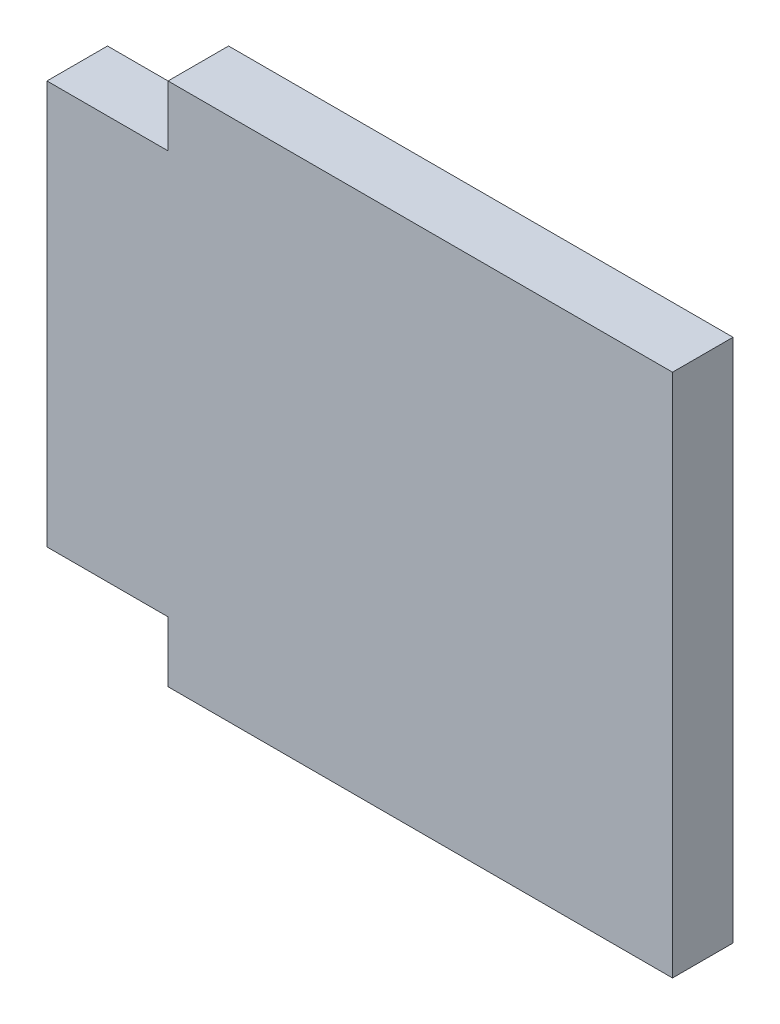
ISO-10303-21;
HEADER;
FILE_DESCRIPTION(('STEP AP214'),'2;1');
FILE_NAME('part.step','',(''),(''),'','','');
FILE_SCHEMA(('AUTOMOTIVE_DESIGN { 1 0 10303 214 1 1 1 1 }'));
ENDSEC;
DATA;
#1=APPLICATION_CONTEXT('core data for automotive mechanical design processes');
#2=APPLICATION_PROTOCOL_DEFINITION('international standard','automotive_design',2000,#1);
#3=PRODUCT_CONTEXT('',#1,'mechanical');
#4=PRODUCT('Part','Part','',(#3));
#5=PRODUCT_RELATED_PRODUCT_CATEGORY('part','',(#4));
#6=PRODUCT_DEFINITION_FORMATION('','',#4);
#7=PRODUCT_DEFINITION_CONTEXT('part definition',#1,'design');
#8=PRODUCT_DEFINITION('design','',#6,#7);
#9=PRODUCT_DEFINITION_SHAPE('','',#8);
#10=(LENGTH_UNIT() NAMED_UNIT(*) SI_UNIT(.MILLI.,.METRE.));
#11=(NAMED_UNIT(*) PLANE_ANGLE_UNIT() SI_UNIT($,.RADIAN.));
#12=(NAMED_UNIT(*) SI_UNIT($,.STERADIAN.) SOLID_ANGLE_UNIT());
#13=UNCERTAINTY_MEASURE_WITH_UNIT(LENGTH_MEASURE(1.E-05),#10,'distance_accuracy_value','');
#14=(GEOMETRIC_REPRESENTATION_CONTEXT(3) GLOBAL_UNCERTAINTY_ASSIGNED_CONTEXT((#13)) GLOBAL_UNIT_ASSIGNED_CONTEXT((#10,
#11,#12)) REPRESENTATION_CONTEXT('',''));
#15=CARTESIAN_POINT('',(0.,0.,0.));
#16=DIRECTION('',(0.,0.,1.));
#17=DIRECTION('',(1.,0.,0.));
#18=AXIS2_PLACEMENT_3D('',#15,#16,#17);
#19=CARTESIAN_POINT('',(6.,0.,3.));
#20=DIRECTION('',(0.,1.,0.));
#21=DIRECTION('',(0.,0.,1.));
#22=AXIS2_PLACEMENT_3D('',#19,#20,#21);
#23=PLANE('',#22);
#24=DIRECTION('',(1.,0.,0.));
#25=VECTOR('',#24,1.);
#26=CARTESIAN_POINT('',(6.,0.,0.));
#27=LINE('',#26,#25);
#28=CARTESIAN_POINT('',(0.,0.,0.));
#29=VERTEX_POINT('',#28);
#30=CARTESIAN_POINT('',(6.,0.,0.));
#31=VERTEX_POINT('',#30);
#32=EDGE_CURVE('E144',#29,#31,#27,.T.);
#33=ORIENTED_EDGE('',*,*,#32,.T.);
#34=DIRECTION('',(0.,0.,-1.));
#35=VECTOR('',#34,1.);
#36=CARTESIAN_POINT('',(6.,0.,3.));
#37=LINE('',#36,#35);
#38=CARTESIAN_POINT('',(6.,0.,3.));
#39=VERTEX_POINT('',#38);
#40=EDGE_CURVE('E11',#39,#31,#37,.T.);
#41=ORIENTED_EDGE('',*,*,#40,.F.);
#42=DIRECTION('',(1.,0.,0.));
#43=VECTOR('',#42,1.);
#44=CARTESIAN_POINT('',(6.,0.,3.));
#45=LINE('',#44,#43);
#46=CARTESIAN_POINT('',(0.,0.,3.));
#47=VERTEX_POINT('',#46);
#48=EDGE_CURVE('E166',#47,#39,#45,.T.);
#49=ORIENTED_EDGE('',*,*,#48,.F.);
#50=DIRECTION('',(0.,0.,-1.));
#51=VECTOR('',#50,1.);
#52=CARTESIAN_POINT('',(0.,0.,3.));
#53=LINE('',#52,#51);
#54=EDGE_CURVE('E140',#47,#29,#53,.T.);
#55=ORIENTED_EDGE('',*,*,#54,.T.);
#56=EDGE_LOOP('',(#33,#41,#49,#55));
#57=FACE_BOUND('',#56,.T.);
#58=ADVANCED_FACE('F43',(#57),#23,.F.);
#59=CARTESIAN_POINT('',(6.,-3.,3.));
#60=DIRECTION('',(1.,0.,0.));
#61=DIRECTION('',(0.,0.,-1.));
#62=AXIS2_PLACEMENT_3D('',#59,#60,#61);
#63=PLANE('',#62);
#64=DIRECTION('',(0.,-1.,0.));
#65=VECTOR('',#64,1.);
#66=CARTESIAN_POINT('',(6.,-3.,0.));
#67=LINE('',#66,#65);
#68=CARTESIAN_POINT('',(6.,-3.,0.));
#69=VERTEX_POINT('',#68);
#70=EDGE_CURVE('E148',#31,#69,#67,.T.);
#71=ORIENTED_EDGE('',*,*,#70,.T.);
#72=DIRECTION('',(0.,0.,-1.));
#73=VECTOR('',#72,1.);
#74=CARTESIAN_POINT('',(6.,-3.,3.));
#75=LINE('',#74,#73);
#76=CARTESIAN_POINT('',(6.,-3.,3.));
#77=VERTEX_POINT('',#76);
#78=EDGE_CURVE('E52',#77,#69,#75,.T.);
#79=ORIENTED_EDGE('',*,*,#78,.F.);
#80=DIRECTION('',(0.,-1.,0.));
#81=VECTOR('',#80,1.);
#82=CARTESIAN_POINT('',(6.,-3.,3.));
#83=LINE('',#82,#81);
#84=EDGE_CURVE('E103',#39,#77,#83,.T.);
#85=ORIENTED_EDGE('',*,*,#84,.F.);
#86=ORIENTED_EDGE('',*,*,#40,.T.);
#87=EDGE_LOOP('',(#71,#79,#85,#86));
#88=FACE_BOUND('',#87,.T.);
#89=ADVANCED_FACE('F212',(#88),#63,.F.);
#90=CARTESIAN_POINT('',(31.,-3.,3.));
#91=DIRECTION('',(0.,1.,0.));
#92=DIRECTION('',(0.,0.,1.));
#93=AXIS2_PLACEMENT_3D('',#90,#91,#92);
#94=PLANE('',#93);
#95=DIRECTION('',(1.,0.,0.));
#96=VECTOR('',#95,1.);
#97=CARTESIAN_POINT('',(31.,-3.,0.));
#98=LINE('',#97,#96);
#99=CARTESIAN_POINT('',(31.,-3.,0.));
#100=VERTEX_POINT('',#99);
#101=EDGE_CURVE('E151',#69,#100,#98,.T.);
#102=ORIENTED_EDGE('',*,*,#101,.T.);
#103=DIRECTION('',(0.,0.,-1.));
#104=VECTOR('',#103,1.);
#105=CARTESIAN_POINT('',(31.,-3.,3.));
#106=LINE('',#105,#104);
#107=CARTESIAN_POINT('',(31.,-3.,3.));
#108=VERTEX_POINT('',#107);
#109=EDGE_CURVE('E177',#108,#100,#106,.T.);
#110=ORIENTED_EDGE('',*,*,#109,.F.);
#111=DIRECTION('',(1.,0.,0.));
#112=VECTOR('',#111,1.);
#113=CARTESIAN_POINT('',(31.,-3.,3.));
#114=LINE('',#113,#112);
#115=EDGE_CURVE('E187',#77,#108,#114,.T.);
#116=ORIENTED_EDGE('',*,*,#115,.F.);
#117=ORIENTED_EDGE('',*,*,#78,.T.);
#118=EDGE_LOOP('',(#102,#110,#116,#117));
#119=FACE_BOUND('',#118,.T.);
#120=ADVANCED_FACE('F185',(#119),#94,.F.);
#121=CARTESIAN_POINT('',(31.,23.,3.));
#122=DIRECTION('',(-1.,0.,0.));
#123=DIRECTION('',(0.,0.,1.));
#124=AXIS2_PLACEMENT_3D('',#121,#122,#123);
#125=PLANE('',#124);
#126=DIRECTION('',(0.,1.,0.));
#127=VECTOR('',#126,1.);
#128=CARTESIAN_POINT('',(31.,23.,0.));
#129=LINE('',#128,#127);
#130=CARTESIAN_POINT('',(31.,23.,0.));
#131=VERTEX_POINT('',#130);
#132=EDGE_CURVE('E154',#100,#131,#129,.T.);
#133=ORIENTED_EDGE('',*,*,#132,.T.);
#134=DIRECTION('',(0.,0.,-1.));
#135=VECTOR('',#134,1.);
#136=CARTESIAN_POINT('',(31.,23.,3.));
#137=LINE('',#136,#135);
#138=CARTESIAN_POINT('',(31.,23.,3.));
#139=VERTEX_POINT('',#138);
#140=EDGE_CURVE('E173',#139,#131,#137,.T.);
#141=ORIENTED_EDGE('',*,*,#140,.F.);
#142=DIRECTION('',(0.,1.,0.));
#143=VECTOR('',#142,1.);
#144=CARTESIAN_POINT('',(31.,23.,3.));
#145=LINE('',#144,#143);
#146=EDGE_CURVE('E200',#108,#139,#145,.T.);
#147=ORIENTED_EDGE('',*,*,#146,.F.);
#148=ORIENTED_EDGE('',*,*,#109,.T.);
#149=EDGE_LOOP('',(#133,#141,#147,#148));
#150=FACE_BOUND('',#149,.T.);
#151=ADVANCED_FACE('F195',(#150),#125,.F.);
#152=CARTESIAN_POINT('',(6.,23.,3.));
#153=DIRECTION('',(0.,-1.,0.));
#154=DIRECTION('',(0.,0.,-1.));
#155=AXIS2_PLACEMENT_3D('',#152,#153,#154);
#156=PLANE('',#155);
#157=DIRECTION('',(-1.,0.,0.));
#158=VECTOR('',#157,1.);
#159=CARTESIAN_POINT('',(6.,23.,0.));
#160=LINE('',#159,#158);
#161=CARTESIAN_POINT('',(6.,23.,0.));
#162=VERTEX_POINT('',#161);
#163=EDGE_CURVE('E157',#131,#162,#160,.T.);
#164=ORIENTED_EDGE('',*,*,#163,.T.);
#165=DIRECTION('',(0.,0.,-1.));
#166=VECTOR('',#165,1.);
#167=CARTESIAN_POINT('',(6.,23.,3.));
#168=LINE('',#167,#166);
#169=CARTESIAN_POINT('',(6.,23.,3.));
#170=VERTEX_POINT('',#169);
#171=EDGE_CURVE('E133',#170,#162,#168,.T.);
#172=ORIENTED_EDGE('',*,*,#171,.F.);
#173=DIRECTION('',(-1.,0.,0.));
#174=VECTOR('',#173,1.);
#175=CARTESIAN_POINT('',(6.,23.,3.));
#176=LINE('',#175,#174);
#177=EDGE_CURVE('E122',#139,#170,#176,.T.);
#178=ORIENTED_EDGE('',*,*,#177,.F.);
#179=ORIENTED_EDGE('',*,*,#140,.T.);
#180=EDGE_LOOP('',(#164,#172,#178,#179));
#181=FACE_BOUND('',#180,.T.);
#182=ADVANCED_FACE('F198',(#181),#156,.F.);
#183=CARTESIAN_POINT('',(6.,20.,3.));
#184=DIRECTION('',(1.,0.,0.));
#185=DIRECTION('',(0.,0.,-1.));
#186=AXIS2_PLACEMENT_3D('',#183,#184,#185);
#187=PLANE('',#186);
#188=DIRECTION('',(0.,-1.,0.));
#189=VECTOR('',#188,1.);
#190=CARTESIAN_POINT('',(6.,20.,0.));
#191=LINE('',#190,#189);
#192=CARTESIAN_POINT('',(6.,20.,0.));
#193=VERTEX_POINT('',#192);
#194=EDGE_CURVE('E131',#162,#193,#191,.T.);
#195=ORIENTED_EDGE('',*,*,#194,.T.);
#196=DIRECTION('',(0.,0.,-1.));
#197=VECTOR('',#196,1.);
#198=CARTESIAN_POINT('',(6.,20.,3.));
#199=LINE('',#198,#197);
#200=CARTESIAN_POINT('',(6.,20.,3.));
#201=VERTEX_POINT('',#200);
#202=EDGE_CURVE('E128',#201,#193,#199,.T.);
#203=ORIENTED_EDGE('',*,*,#202,.F.);
#204=DIRECTION('',(0.,-1.,0.));
#205=VECTOR('',#204,1.);
#206=CARTESIAN_POINT('',(6.,20.,3.));
#207=LINE('',#206,#205);
#208=EDGE_CURVE('E116',#170,#201,#207,.T.);
#209=ORIENTED_EDGE('',*,*,#208,.F.);
#210=ORIENTED_EDGE('',*,*,#171,.T.);
#211=EDGE_LOOP('',(#195,#203,#209,#210));
#212=FACE_BOUND('',#211,.T.);
#213=ADVANCED_FACE('F129',(#212),#187,.F.);
#214=CARTESIAN_POINT('',(0.,20.,3.));
#215=DIRECTION('',(0.,-1.,0.));
#216=DIRECTION('',(0.,0.,-1.));
#217=AXIS2_PLACEMENT_3D('',#214,#215,#216);
#218=PLANE('',#217);
#219=DIRECTION('',(-1.,0.,0.));
#220=VECTOR('',#219,1.);
#221=CARTESIAN_POINT('',(0.,20.,0.));
#222=LINE('',#221,#220);
#223=CARTESIAN_POINT('',(0.,20.,0.));
#224=VERTEX_POINT('',#223);
#225=EDGE_CURVE('E89',#193,#224,#222,.T.);
#226=ORIENTED_EDGE('',*,*,#225,.T.);
#227=DIRECTION('',(0.,0.,-1.));
#228=VECTOR('',#227,1.);
#229=CARTESIAN_POINT('',(0.,20.,3.));
#230=LINE('',#229,#228);
#231=CARTESIAN_POINT('',(0.,20.,3.));
#232=VERTEX_POINT('',#231);
#233=EDGE_CURVE('E134',#232,#224,#230,.T.);
#234=ORIENTED_EDGE('',*,*,#233,.F.);
#235=DIRECTION('',(-1.,0.,0.));
#236=VECTOR('',#235,1.);
#237=CARTESIAN_POINT('',(0.,20.,3.));
#238=LINE('',#237,#236);
#239=EDGE_CURVE('E120',#201,#232,#238,.T.);
#240=ORIENTED_EDGE('',*,*,#239,.F.);
#241=ORIENTED_EDGE('',*,*,#202,.T.);
#242=EDGE_LOOP('',(#226,#234,#240,#241));
#243=FACE_BOUND('',#242,.T.);
#244=ADVANCED_FACE('F136',(#243),#218,.F.);
#245=CARTESIAN_POINT('',(0.,0.,3.));
#246=DIRECTION('',(1.,0.,0.));
#247=DIRECTION('',(0.,0.,-1.));
#248=AXIS2_PLACEMENT_3D('',#245,#246,#247);
#249=PLANE('',#248);
#250=DIRECTION('',(0.,-1.,0.));
#251=VECTOR('',#250,1.);
#252=CARTESIAN_POINT('',(0.,0.,0.));
#253=LINE('',#252,#251);
#254=EDGE_CURVE('E95',#224,#29,#253,.T.);
#255=ORIENTED_EDGE('',*,*,#254,.T.);
#256=ORIENTED_EDGE('',*,*,#54,.F.);
#257=DIRECTION('',(0.,-1.,0.));
#258=VECTOR('',#257,1.);
#259=CARTESIAN_POINT('',(0.,0.,3.));
#260=LINE('',#259,#258);
#261=EDGE_CURVE('E60',#232,#47,#260,.T.);
#262=ORIENTED_EDGE('',*,*,#261,.F.);
#263=ORIENTED_EDGE('',*,*,#233,.T.);
#264=EDGE_LOOP('',(#255,#256,#262,#263));
#265=FACE_BOUND('',#264,.T.);
#266=ADVANCED_FACE('F228',(#265),#249,.F.);
#267=CARTESIAN_POINT('',(0.,0.,3.));
#268=DIRECTION('',(0.,0.,-1.));
#269=DIRECTION('',(-1.,0.,0.));
#270=AXIS2_PLACEMENT_3D('',#267,#268,#269);
#271=PLANE('',#270);
#272=ORIENTED_EDGE('',*,*,#48,.T.);
#273=ORIENTED_EDGE('',*,*,#84,.T.);
#274=ORIENTED_EDGE('',*,*,#115,.T.);
#275=ORIENTED_EDGE('',*,*,#146,.T.);
#276=ORIENTED_EDGE('',*,*,#177,.T.);
#277=ORIENTED_EDGE('',*,*,#208,.T.);
#278=ORIENTED_EDGE('',*,*,#239,.T.);
#279=ORIENTED_EDGE('',*,*,#261,.T.);
#280=EDGE_LOOP('',(#272,#273,#274,#275,#276,#277,#278,#279));
#281=FACE_BOUND('',#280,.T.);
#282=ADVANCED_FACE('F118',(#281),#271,.F.);
#283=CARTESIAN_POINT('',(0.,0.,0.));
#284=DIRECTION('',(0.,0.,-1.));
#285=DIRECTION('',(-1.,0.,0.));
#286=AXIS2_PLACEMENT_3D('',#283,#284,#285);
#287=PLANE('',#286);
#288=ORIENTED_EDGE('',*,*,#32,.F.);
#289=ORIENTED_EDGE('',*,*,#254,.F.);
#290=ORIENTED_EDGE('',*,*,#225,.F.);
#291=ORIENTED_EDGE('',*,*,#194,.F.);
#292=ORIENTED_EDGE('',*,*,#163,.F.);
#293=ORIENTED_EDGE('',*,*,#132,.F.);
#294=ORIENTED_EDGE('',*,*,#101,.F.);
#295=ORIENTED_EDGE('',*,*,#70,.F.);
#296=EDGE_LOOP('',(#288,#289,#290,#291,#292,#293,#294,#295));
#297=FACE_BOUND('',#296,.T.);
#298=ADVANCED_FACE('F191',(#297),#287,.T.);
#299=CLOSED_SHELL('',(#58,#89,#120,#151,#182,#213,#244,#266,#282,#298));
#300=MANIFOLD_SOLID_BREP('B2',#299);
#301=ADVANCED_BREP_SHAPE_REPRESENTATION('',(#18,#300),#14);
#302=SHAPE_DEFINITION_REPRESENTATION(#9,#301);
ENDSEC;
END-ISO-10303-21;
